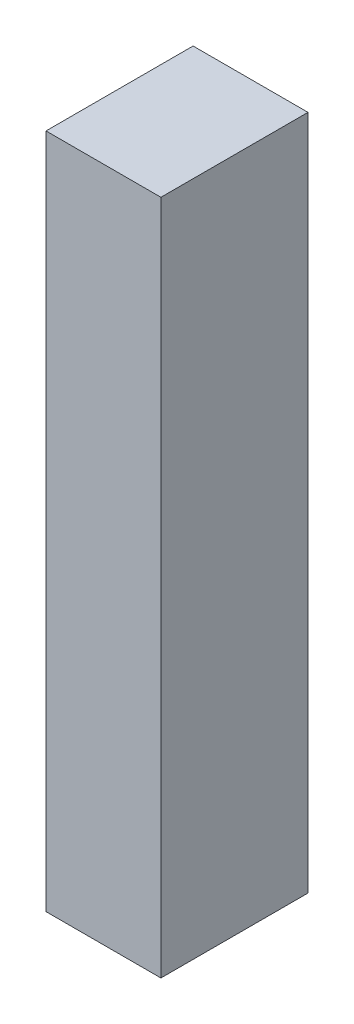
ISO-10303-21;
HEADER;
FILE_DESCRIPTION(('STEP AP214'),'2;1');
FILE_NAME('part.step','',(''),(''),'','','');
FILE_SCHEMA(('AUTOMOTIVE_DESIGN { 1 0 10303 214 1 1 1 1 }'));
ENDSEC;
DATA;
#1=APPLICATION_CONTEXT('core data for automotive mechanical design processes');
#2=APPLICATION_PROTOCOL_DEFINITION('international standard','automotive_design',2000,#1);
#3=PRODUCT_CONTEXT('',#1,'mechanical');
#4=PRODUCT('Part','Part','',(#3));
#5=PRODUCT_RELATED_PRODUCT_CATEGORY('part','',(#4));
#6=PRODUCT_DEFINITION_FORMATION('','',#4);
#7=PRODUCT_DEFINITION_CONTEXT('part definition',#1,'design');
#8=PRODUCT_DEFINITION('design','',#6,#7);
#9=PRODUCT_DEFINITION_SHAPE('','',#8);
#10=(LENGTH_UNIT() NAMED_UNIT(*) SI_UNIT(.MILLI.,.METRE.));
#11=(NAMED_UNIT(*) PLANE_ANGLE_UNIT() SI_UNIT($,.RADIAN.));
#12=(NAMED_UNIT(*) SI_UNIT($,.STERADIAN.) SOLID_ANGLE_UNIT());
#13=UNCERTAINTY_MEASURE_WITH_UNIT(LENGTH_MEASURE(1.E-05),#10,'distance_accuracy_value','');
#14=(GEOMETRIC_REPRESENTATION_CONTEXT(3) GLOBAL_UNCERTAINTY_ASSIGNED_CONTEXT((#13)) GLOBAL_UNIT_ASSIGNED_CONTEXT((#10,
#11,#12)) REPRESENTATION_CONTEXT('',''));
#15=CARTESIAN_POINT('',(0.,0.,0.));
#16=DIRECTION('',(0.,0.,1.));
#17=DIRECTION('',(1.,0.,0.));
#18=AXIS2_PLACEMENT_3D('',#15,#16,#17);
#19=CARTESIAN_POINT('',(61.81000122,55.500000630161,-2.606522083282));
#20=DIRECTION('',(-0.999999999999999,4.371138884185E-08,0.));
#21=DIRECTION('',(-4.371138884185E-08,-0.999999999999999,0.));
#22=AXIS2_PLACEMENT_3D('',#19,#20,#21);
#23=PLANE('',#22);
#24=DIRECTION('',(0.,0.999999999999996,8.74227765641297E-08));
#25=VECTOR('',#24,1.);
#26=CARTESIAN_POINT('',(61.810001059251,55.500000617485,-1.806522083282));
#27=LINE('',#26,#25);
#28=CARTESIAN_POINT('',(61.8100010592512,51.8225006165009,-1.80652240477982));
#29=VERTEX_POINT('',#28);
#30=CARTESIAN_POINT('',(61.8100013003744,59.1775005602227,-1.80652192253369));
#31=VERTEX_POINT('',#30);
#32=EDGE_CURVE('E69',#29,#31,#27,.T.);
#33=ORIENTED_EDGE('',*,*,#32,.T.);
#34=DIRECTION('',(0.,-8.74227765641297E-08,0.999999999999996));
#35=VECTOR('',#34,1.);
#36=CARTESIAN_POINT('',(61.810001380749,59.1775005427379,-1.60652176178501));
#37=LINE('',#36,#35);
#38=CARTESIAN_POINT('',(61.8100013807489,59.1775006378105,-3.40652176178487));
#39=VERTEX_POINT('',#38);
#40=EDGE_CURVE('E56',#39,#31,#37,.T.);
#41=ORIENTED_EDGE('',*,*,#40,.F.);
#42=DIRECTION('',(0.,-0.999999999999996,-8.74227765641297E-08));
#43=VECTOR('',#42,1.);
#44=CARTESIAN_POINT('',(61.810001380749,55.500000757361,-3.406522083282));
#45=LINE('',#44,#43);
#46=CARTESIAN_POINT('',(61.8100011396257,51.8225007000991,-3.40652208328232));
#47=VERTEX_POINT('',#46);
#48=EDGE_CURVE('E62',#39,#47,#45,.T.);
#49=ORIENTED_EDGE('',*,*,#48,.T.);
#50=DIRECTION('',(0.,0.,1.));
#51=VECTOR('',#50,1.);
#52=CARTESIAN_POINT('',(61.8100010592514,51.822500700099,-2.606522083282));
#53=LINE('',#52,#51);
#54=EDGE_CURVE('E20',#47,#29,#53,.T.);
#55=ORIENTED_EDGE('',*,*,#54,.T.);
#56=EDGE_LOOP('',(#33,#41,#49,#55));
#57=FACE_BOUND('',#56,.T.);
#58=ADVANCED_FACE('F17',(#57),#23,.T.);
#59=CARTESIAN_POINT('',(60.50000122,55.500000757361,-3.406522083282));
#60=DIRECTION('',(0.,-8.74227765641297E-08,0.999999999999996));
#61=DIRECTION('',(0.,-0.999999999999996,-8.74227765641297E-08));
#62=AXIS2_PLACEMENT_3D('',#59,#60,#61);
#63=PLANE('',#62);
#64=DIRECTION('',(0.999999999999999,-4.37113888418496E-08,0.));
#65=VECTOR('',#64,1.);
#66=CARTESIAN_POINT('',(57.940001380749,59.177500869262,-3.40652176178498));
#67=LINE('',#66,#65);
#68=CARTESIAN_POINT('',(63.06000122,59.1775006454599,-3.40652192253363));
#69=VERTEX_POINT('',#68);
#70=EDGE_CURVE('E64',#69,#39,#67,.F.);
#71=ORIENTED_EDGE('',*,*,#70,.F.);
#72=DIRECTION('',(4.371138884185E-08,0.999999999999999,0.));
#73=VECTOR('',#72,1.);
#74=CARTESIAN_POINT('',(63.060001380749,59.177500488099,-3.40652240478));
#75=LINE('',#74,#73);
#76=CARTESIAN_POINT('',(63.0600010592512,51.8225006378103,-3.40652240477963));
#77=VERTEX_POINT('',#76);
#78=EDGE_CURVE('E83',#77,#69,#75,.T.);
#79=ORIENTED_EDGE('',*,*,#78,.F.);
#80=DIRECTION('',(0.999999999999999,-4.37113888418496E-08,0.));
#81=VECTOR('',#80,1.);
#82=CARTESIAN_POINT('',(63.060001059251,51.82250064546,-3.40652240478001));
#83=LINE('',#82,#81);
#84=EDGE_CURVE('E67',#47,#77,#83,.T.);
#85=ORIENTED_EDGE('',*,*,#84,.F.);
#86=ORIENTED_EDGE('',*,*,#48,.F.);
#87=EDGE_LOOP('',(#71,#79,#85,#86));
#88=FACE_BOUND('',#87,.T.);
#89=ADVANCED_FACE('F63',(#88),#63,.F.);
#90=CARTESIAN_POINT('',(57.940001380749,59.177500711901,-1.606521761785));
#91=DIRECTION('',(4.37113888418498E-08,0.999999999999995,8.74227765641296E-08));
#92=DIRECTION('',(0.,-8.74227765641297E-08,0.999999999999996));
#93=AXIS2_PLACEMENT_3D('',#90,#91,#92);
#94=PLANE('',#93);
#95=DIRECTION('',(1.,0.,0.));
#96=VECTOR('',#95,1.);
#97=CARTESIAN_POINT('',(60.50000122,59.177500560223,-1.80652176178474));
#98=LINE('',#97,#96);
#99=CARTESIAN_POINT('',(63.060001380749,59.1775005542124,-1.80652176178494));
#100=VERTEX_POINT('',#99);
#101=EDGE_CURVE('E71',#31,#100,#98,.T.);
#102=ORIENTED_EDGE('',*,*,#101,.T.);
#103=DIRECTION('',(0.,0.,1.));
#104=VECTOR('',#103,1.);
#105=CARTESIAN_POINT('',(63.060001380749,59.17750064546,-1.606521761785));
#106=LINE('',#105,#104);
#107=EDGE_CURVE('E75',#69,#100,#106,.T.);
#108=ORIENTED_EDGE('',*,*,#107,.F.);
#109=ORIENTED_EDGE('',*,*,#70,.T.);
#110=ORIENTED_EDGE('',*,*,#40,.T.);
#111=EDGE_LOOP('',(#102,#108,#109,#110));
#112=FACE_BOUND('',#111,.T.);
#113=ADVANCED_FACE('F73',(#112),#94,.T.);
#114=CARTESIAN_POINT('',(60.50000122,55.500000617485,-1.806522083282));
#115=DIRECTION('',(0.,8.74227765641297E-08,-0.999999999999996));
#116=DIRECTION('',(0.,0.999999999999996,8.74227765641297E-08));
#117=AXIS2_PLACEMENT_3D('',#114,#115,#116);
#118=PLANE('',#117);
#119=DIRECTION('',(0.999999999999999,-4.37113888418496E-08,0.));
#120=VECTOR('',#119,1.);
#121=CARTESIAN_POINT('',(63.060001059251,51.8225005055836,-1.80652240478));
#122=LINE('',#121,#120);
#123=CARTESIAN_POINT('',(63.0600012200002,51.8225005055831,-1.80652224403089));
#124=VERTEX_POINT('',#123);
#125=EDGE_CURVE('E35',#124,#29,#122,.F.);
#126=ORIENTED_EDGE('',*,*,#125,.F.);
#127=DIRECTION('',(4.371138884185E-08,0.999999999999999,0.));
#128=VECTOR('',#127,1.);
#129=CARTESIAN_POINT('',(63.060001380749,59.177500488099,-1.806521761785));
#130=LINE('',#129,#128);
#131=EDGE_CURVE('E26',#100,#124,#130,.F.);
#132=ORIENTED_EDGE('',*,*,#131,.F.);
#133=ORIENTED_EDGE('',*,*,#101,.F.);
#134=ORIENTED_EDGE('',*,*,#32,.F.);
#135=EDGE_LOOP('',(#126,#132,#133,#134));
#136=FACE_BOUND('',#135,.T.);
#137=ADVANCED_FACE('F89',(#136),#118,.F.);
#138=CARTESIAN_POINT('',(63.060001059251,51.822500488099,-1.60652240478));
#139=DIRECTION('',(-4.37113888418498E-08,-0.999999999999995,-8.74227765641296E-08));
#140=DIRECTION('',(0.,8.74227765641297E-08,-0.999999999999996));
#141=AXIS2_PLACEMENT_3D('',#138,#139,#140);
#142=PLANE('',#141);
#143=ORIENTED_EDGE('',*,*,#125,.T.);
#144=ORIENTED_EDGE('',*,*,#54,.F.);
#145=ORIENTED_EDGE('',*,*,#84,.T.);
#146=DIRECTION('',(0.,0.,1.));
#147=VECTOR('',#146,1.);
#148=CARTESIAN_POINT('',(63.0600010592517,51.822500505583,-1.606521761785));
#149=LINE('',#148,#147);
#150=EDGE_CURVE('E11',#124,#77,#149,.F.);
#151=ORIENTED_EDGE('',*,*,#150,.F.);
#152=EDGE_LOOP('',(#143,#144,#145,#151));
#153=FACE_BOUND('',#152,.T.);
#154=ADVANCED_FACE('F91',(#153),#142,.T.);
#155=CARTESIAN_POINT('',(63.060001380749,59.177500488099,-1.606521761785));
#156=DIRECTION('',(0.999999999999999,-4.371138884185E-08,0.));
#157=DIRECTION('',(4.371138884185E-08,0.999999999999999,0.));
#158=AXIS2_PLACEMENT_3D('',#155,#156,#157);
#159=PLANE('',#158);
#160=ORIENTED_EDGE('',*,*,#131,.T.);
#161=ORIENTED_EDGE('',*,*,#150,.T.);
#162=ORIENTED_EDGE('',*,*,#78,.T.);
#163=ORIENTED_EDGE('',*,*,#107,.T.);
#164=EDGE_LOOP('',(#160,#161,#162,#163));
#165=FACE_BOUND('',#164,.T.);
#166=ADVANCED_FACE('F88',(#165),#159,.T.);
#167=CLOSED_SHELL('',(#58,#89,#113,#137,#154,#166));
#168=MANIFOLD_SOLID_BREP('B1',#167);
#169=ADVANCED_BREP_SHAPE_REPRESENTATION('',(#18,#168),#14);
#170=SHAPE_DEFINITION_REPRESENTATION(#9,#169);
ENDSEC;
END-ISO-10303-21;
